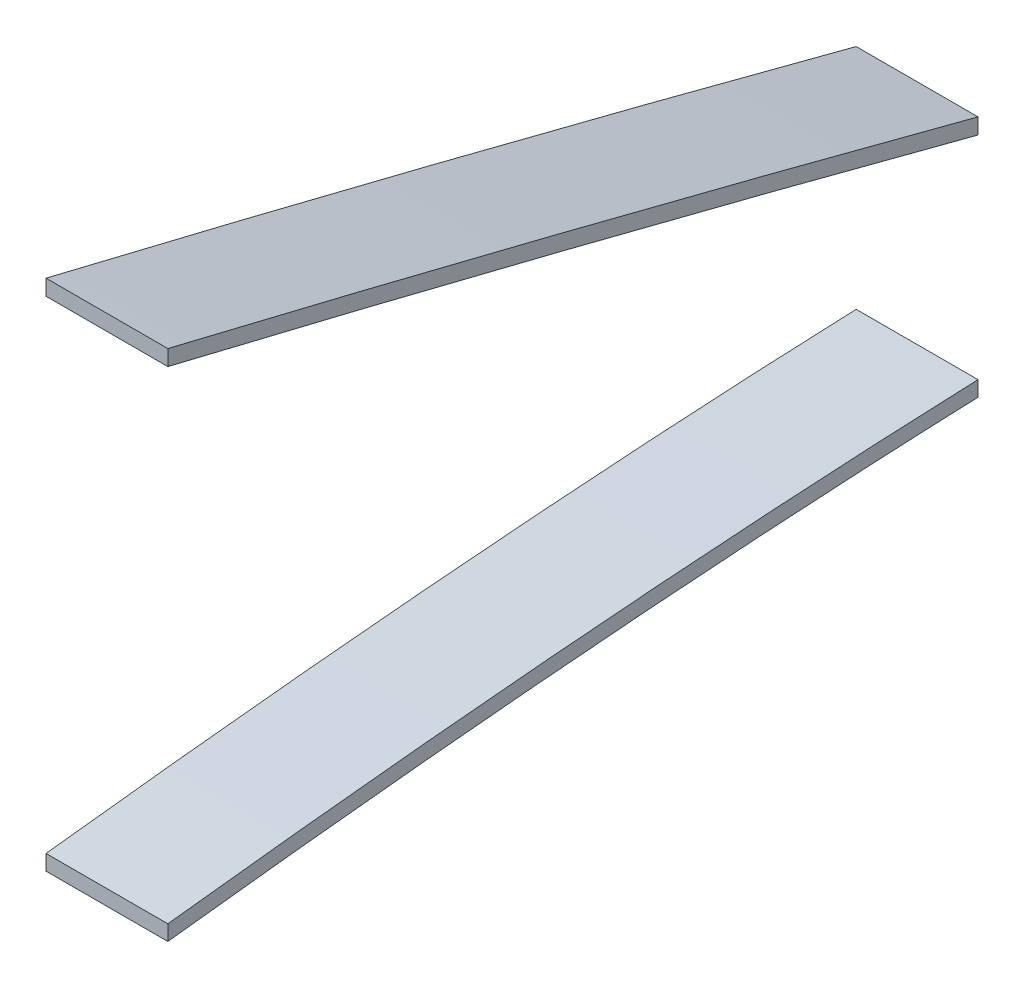
ISO-10303-21;
HEADER;
FILE_DESCRIPTION(('STEP AP214'),'2;1');
FILE_NAME('part.step','',(''),(''),'','','');
FILE_SCHEMA(('AUTOMOTIVE_DESIGN { 1 0 10303 214 1 1 1 1 }'));
ENDSEC;
DATA;
#1=APPLICATION_CONTEXT('core data for automotive mechanical design processes');
#2=APPLICATION_PROTOCOL_DEFINITION('international standard','automotive_design',2000,#1);
#3=PRODUCT_CONTEXT('',#1,'mechanical');
#4=PRODUCT('Part','Part','',(#3));
#5=PRODUCT_RELATED_PRODUCT_CATEGORY('part','',(#4));
#6=PRODUCT_DEFINITION_FORMATION('','',#4);
#7=PRODUCT_DEFINITION_CONTEXT('part definition',#1,'design');
#8=PRODUCT_DEFINITION('design','',#6,#7);
#9=PRODUCT_DEFINITION_SHAPE('','',#8);
#10=(LENGTH_UNIT() NAMED_UNIT(*) SI_UNIT(.MILLI.,.METRE.));
#11=(NAMED_UNIT(*) PLANE_ANGLE_UNIT() SI_UNIT($,.RADIAN.));
#12=(NAMED_UNIT(*) SI_UNIT($,.STERADIAN.) SOLID_ANGLE_UNIT());
#13=UNCERTAINTY_MEASURE_WITH_UNIT(LENGTH_MEASURE(1.E-05),#10,'distance_accuracy_value','');
#14=(GEOMETRIC_REPRESENTATION_CONTEXT(3) GLOBAL_UNCERTAINTY_ASSIGNED_CONTEXT((#13)) GLOBAL_UNIT_ASSIGNED_CONTEXT((#10,
#11,#12)) REPRESENTATION_CONTEXT('',''));
#15=CARTESIAN_POINT('',(0.,0.,0.));
#16=DIRECTION('',(0.,0.,1.));
#17=DIRECTION('',(1.,0.,0.));
#18=AXIS2_PLACEMENT_3D('',#15,#16,#17);
#19=CARTESIAN_POINT('',(6.35,-0.0168698697803817,-1.58896756731634));
#20=CARTESIAN_POINT('',(6.35,-0.278093575405853,-1.59778567538342));
#21=CARTESIAN_POINT('',(6.35,-0.817071560687652,-1.61698852295705));
#22=CARTESIAN_POINT('',(6.35,-1.5250777063707,-1.67055282833132));
#23=CARTESIAN_POINT('',(6.35,-2.23953985681244,-1.77272911801303));
#24=CARTESIAN_POINT('',(6.35,-3.2170399545111,-1.96449824112025));
#25=CARTESIAN_POINT('',(6.35,-4.47308667544305,-2.28220569209763));
#26=CARTESIAN_POINT('',(6.35,-6.45569044251883,-2.89195735088694));
#27=CARTESIAN_POINT('',(6.35,-8.91270651117956,-3.82502314776842));
#28=CARTESIAN_POINT('',(6.35,-12.764870838745,-5.5748206630622));
#29=CARTESIAN_POINT('',(6.35,-17.4946939025467,-8.15485573251682));
#30=CARTESIAN_POINT('',(6.35,-25.0362925123383,-12.5101141172109));
#31=CARTESIAN_POINT('',(6.35,-34.2942736430627,-18.1123469115671));
#32=CARTESIAN_POINT('',(6.35,-45.1810251619868,-25.230105591362));
#33=CARTESIAN_POINT('',(6.35,-53.8227317037622,-31.689080193494));
#34=CARTESIAN_POINT('',(6.35,-60.4726069561864,-37.2128263714012));
#35=CARTESIAN_POINT('',(6.35,-66.962933883926,-42.9501181028563));
#36=CARTESIAN_POINT('',(6.35,-74.4394415189749,-50.6018486257846));
#37=CARTESIAN_POINT('',(6.35,-81.5128401744618,-61.3489491705267));
#38=CARTESIAN_POINT('',(6.35,-86.5672767678429,-73.159446713042));
#39=CARTESIAN_POINT('',(6.35,-90.1112052326867,-85.6410448979768));
#40=CARTESIAN_POINT('',(6.35,-92.857558138955,-98.3222524640694));
#41=CARTESIAN_POINT('',(6.35,-95.4884593166877,-115.423728280371));
#42=CARTESIAN_POINT('',(6.35,-97.1574166185787,-137.057042994171));
#43=CARTESIAN_POINT('',(6.35,-97.3913575328663,-163.09710904146));
#44=CARTESIAN_POINT('',(6.35,-96.2564047503436,-189.13539327614));
#45=CARTESIAN_POINT('',(6.35,-94.0860606996018,-215.119495237718));
#46=CARTESIAN_POINT('',(6.35,-91.1098097619557,-241.033805840036));
#47=CARTESIAN_POINT('',(6.35,-86.3075505253941,-275.492090275555));
#48=CARTESIAN_POINT('',(6.35,-79.1224787107728,-318.404073319138));
#49=CARTESIAN_POINT('',(6.35,-69.4844112272533,-369.735601224399));
#50=CARTESIAN_POINT('',(6.35,-59.4768027176839,-421.013521647914));
#51=CARTESIAN_POINT('',(6.35,-49.6150737617801,-472.334965082267));
#52=CARTESIAN_POINT('',(6.35,-40.3589258634731,-523.784524343132));
#53=CARTESIAN_POINT('',(6.35,-32.1357040424635,-575.425677634064));
#54=CARTESIAN_POINT('',(6.35,-25.4119138999749,-627.302116658694));
#55=CARTESIAN_POINT('',(6.35,-21.5032379052925,-670.741751073083));
#56=CARTESIAN_POINT('',(6.35,-19.8162969755378,-705.603952790565));
#57=CARTESIAN_POINT('',(6.35,-19.41220767749,-731.78903132868));
#58=CARTESIAN_POINT('',(6.35,-20.1502189024007,-758.00034587372));
#59=CARTESIAN_POINT('',(6.35,-21.867269156407,-775.446944988084));
#60=CARTESIAN_POINT('',(6.35,-23.1184231765888,-784.106482277342));
#61=B_SPLINE_CURVE_WITH_KNOTS('',3,(#19,#20,#21,#22,#23,#24,#25,#26,#27,#28,#29,#30,#31,#32,#33,
#34,#35,#36,#37,#38,#39,#40,#41,#42,#43,#44,#45,#46,#47,#48,#49,#50,#51,#52,#53,#54,#55,#56,#57,
#58,#59,#60),.UNSPECIFIED.,.F.,.F.,(4,1,1,1,1,1,1,1,1,1,1,1,1,1,1,1,1,1,1,1,1,1,1,1,1,1,1,1,1,1,
1,1,1,1,1,1,1,1,1,4),(8.23654502113766E-05,0.00103762246756374,0.00199287948491611,
0.00294813650226847,0.00390339351962084,0.00581390755432556,0.00772442158903029,
0.0115454496584398,0.0153664777278492,0.0230085338666681,0.030650590005487,0.0459347022831249,
0.0612188145607627,0.0765029268384006,0.0841449829772195,0.0917870391160384,0.107071151393676,
0.122355263671314,0.137639375948952,0.15292348822659,0.168207600504228,0.183491712781865,
0.214059937337141,0.244628161892417,0.275196386447692,0.305764611002968,0.336332835558244,
0.366901060113519,0.428037509224071,0.489173958334622,0.550310407445173,0.611446856555725,
0.672583305666276,0.733719754776827,0.794856203887379,0.85599265299793,0.886560877553206,
0.917129102108482,0.947697326663757,0.978265551219033),.UNSPECIFIED.);
#62=DIRECTION('',(-1.,0.,0.));
#63=VECTOR('',#62,1.);
#64=SURFACE_OF_LINEAR_EXTRUSION('',#61,#63);
#65=CARTESIAN_POINT('',(-6.35,-0.0168698697803817,-1.58896756731634));
#66=CARTESIAN_POINT('',(-6.35,-0.278093575405853,-1.59778567538342));
#67=CARTESIAN_POINT('',(-6.35,-0.817071560687652,-1.61698852295705));
#68=CARTESIAN_POINT('',(-6.35,-1.5250777063707,-1.67055282833132));
#69=CARTESIAN_POINT('',(-6.35,-2.23953985681244,-1.77272911801303));
#70=CARTESIAN_POINT('',(-6.35,-3.2170399545111,-1.96449824112025));
#71=CARTESIAN_POINT('',(-6.35,-4.47308667544305,-2.28220569209763));
#72=CARTESIAN_POINT('',(-6.35,-6.45569044251883,-2.89195735088694));
#73=CARTESIAN_POINT('',(-6.35,-8.91270651117956,-3.82502314776842));
#74=CARTESIAN_POINT('',(-6.35,-12.764870838745,-5.5748206630622));
#75=CARTESIAN_POINT('',(-6.35,-17.4946939025467,-8.15485573251682));
#76=CARTESIAN_POINT('',(-6.35,-25.0362925123383,-12.5101141172109));
#77=CARTESIAN_POINT('',(-6.35,-34.2942736430627,-18.1123469115671));
#78=CARTESIAN_POINT('',(-6.35,-45.1810251619868,-25.230105591362));
#79=CARTESIAN_POINT('',(-6.35,-53.8227317037622,-31.689080193494));
#80=CARTESIAN_POINT('',(-6.35,-60.4726069561864,-37.2128263714012));
#81=CARTESIAN_POINT('',(-6.35,-66.962933883926,-42.9501181028563));
#82=CARTESIAN_POINT('',(-6.35,-74.4394415189749,-50.6018486257846));
#83=CARTESIAN_POINT('',(-6.35,-81.5128401744618,-61.3489491705267));
#84=CARTESIAN_POINT('',(-6.35,-86.5672767678429,-73.159446713042));
#85=CARTESIAN_POINT('',(-6.35,-90.1112052326867,-85.6410448979768));
#86=CARTESIAN_POINT('',(-6.35,-92.857558138955,-98.3222524640694));
#87=CARTESIAN_POINT('',(-6.35,-95.4884593166877,-115.423728280371));
#88=CARTESIAN_POINT('',(-6.35,-97.1574166185787,-137.057042994171));
#89=CARTESIAN_POINT('',(-6.35,-97.3913575328663,-163.09710904146));
#90=CARTESIAN_POINT('',(-6.35,-96.2564047503436,-189.13539327614));
#91=CARTESIAN_POINT('',(-6.35,-94.0860606996018,-215.119495237718));
#92=CARTESIAN_POINT('',(-6.35,-91.1098097619557,-241.033805840036));
#93=CARTESIAN_POINT('',(-6.35,-86.3075505253941,-275.492090275555));
#94=CARTESIAN_POINT('',(-6.35,-79.1224787107728,-318.404073319138));
#95=CARTESIAN_POINT('',(-6.35,-69.4844112272533,-369.735601224399));
#96=CARTESIAN_POINT('',(-6.35,-59.4768027176839,-421.013521647914));
#97=CARTESIAN_POINT('',(-6.35,-49.6150737617801,-472.334965082267));
#98=CARTESIAN_POINT('',(-6.35,-40.3589258634731,-523.784524343132));
#99=CARTESIAN_POINT('',(-6.35,-32.1357040424635,-575.425677634064));
#100=CARTESIAN_POINT('',(-6.35,-25.4119138999749,-627.302116658694));
#101=CARTESIAN_POINT('',(-6.35,-21.5032379052925,-670.741751073083));
#102=CARTESIAN_POINT('',(-6.35,-19.8162969755378,-705.603952790565));
#103=CARTESIAN_POINT('',(-6.35,-19.41220767749,-731.78903132868));
#104=CARTESIAN_POINT('',(-6.35,-20.1502189024007,-758.00034587372));
#105=CARTESIAN_POINT('',(-6.35,-21.867269156407,-775.446944988084));
#106=CARTESIAN_POINT('',(-6.35,-23.1184231765888,-784.106482277342));
#107=B_SPLINE_CURVE_WITH_KNOTS('',3,(#65,#66,#67,#68,#69,#70,#71,#72,#73,#74,#75,#76,#77,#78,
#79,#80,#81,#82,#83,#84,#85,#86,#87,#88,#89,#90,#91,#92,#93,#94,#95,#96,#97,#98,#99,#100,#101,
#102,#103,#104,#105,#106),.UNSPECIFIED.,.F.,.F.,(4,1,1,1,1,1,1,1,1,1,1,1,1,1,1,1,1,1,1,1,1,1,1,
1,1,1,1,1,1,1,1,1,1,1,1,1,1,1,1,4),(8.23654502113766E-05,0.00103762246756374,
0.00199287948491611,0.00294813650226847,0.00390339351962084,0.00581390755432556,
0.00772442158903029,0.0115454496584398,0.0153664777278492,0.0230085338666681,0.030650590005487,
0.0459347022831249,0.0612188145607627,0.0765029268384006,0.0841449829772195,0.0917870391160384,
0.107071151393676,0.122355263671314,0.137639375948952,0.15292348822659,0.168207600504228,
0.183491712781865,0.214059937337141,0.244628161892417,0.275196386447692,0.305764611002968,
0.336332835558244,0.366901060113519,0.428037509224071,0.489173958334622,0.550310407445173,
0.611446856555725,0.672583305666276,0.733719754776827,0.794856203887379,0.85599265299793,
0.886560877553206,0.917129102108482,0.947697326663757,0.978265551219033),.UNSPECIFIED.);
#108=CARTESIAN_POINT('',(-6.35,-27.0325991179698,-616.096053398591));
#109=VERTEX_POINT('',#108);
#110=CARTESIAN_POINT('',(-6.35,-20.1371548542674,-700.551053398607));
#111=VERTEX_POINT('',#110);
#112=EDGE_CURVE('E125',#109,#111,#107,.T.);
#113=ORIENTED_EDGE('',*,*,#112,.F.);
#114=DIRECTION('',(-1.,0.,0.));
#115=VECTOR('',#114,1.);
#116=CARTESIAN_POINT('',(6.35,-27.0325991179698,-616.096053398591));
#117=LINE('',#116,#115);
#118=CARTESIAN_POINT('',(6.35,-27.0325991179698,-616.096053398591));
#119=VERTEX_POINT('',#118);
#120=EDGE_CURVE('E12',#119,#109,#117,.T.);
#121=ORIENTED_EDGE('',*,*,#120,.F.);
#122=CARTESIAN_POINT('',(6.35,-20.1371548542674,-700.551053398607));
#123=VERTEX_POINT('',#122);
#124=EDGE_CURVE('E94',#119,#123,#61,.T.);
#125=ORIENTED_EDGE('',*,*,#124,.T.);
#126=DIRECTION('',(-1.,0.,0.));
#127=VECTOR('',#126,1.);
#128=CARTESIAN_POINT('',(6.35,-20.1371548542674,-700.551053398607));
#129=LINE('',#128,#127);
#130=EDGE_CURVE('E62',#123,#111,#129,.T.);
#131=ORIENTED_EDGE('',*,*,#130,.T.);
#132=EDGE_LOOP('',(#113,#121,#125,#131));
#133=FACE_BOUND('',#132,.T.);
#134=ADVANCED_FACE('F45',(#133),#64,.T.);
#135=CARTESIAN_POINT('',(6.35,-4.60005606692878E-11,-616.096053398593));
#136=DIRECTION('',(0.,0.,-1.));
#137=DIRECTION('',(0.,1.,0.));
#138=AXIS2_PLACEMENT_3D('',#135,#136,#137);
#139=PLANE('',#138);
#140=DIRECTION('',(0.,-1.,0.));
#141=VECTOR('',#140,1.);
#142=CARTESIAN_POINT('',(-6.35,-4.60005606692878E-11,-616.096053398593));
#143=LINE('',#142,#141);
#144=CARTESIAN_POINT('',(-6.35,-28.6308055427422,-616.096053398591));
#145=VERTEX_POINT('',#144);
#146=EDGE_CURVE('E100',#109,#145,#143,.T.);
#147=ORIENTED_EDGE('',*,*,#146,.T.);
#148=DIRECTION('',(-1.,0.,0.));
#149=VECTOR('',#148,1.);
#150=CARTESIAN_POINT('',(6.35,-28.6308055427422,-616.096053398591));
#151=LINE('',#150,#149);
#152=CARTESIAN_POINT('',(6.35,-28.6308055427422,-616.096053398591));
#153=VERTEX_POINT('',#152);
#154=EDGE_CURVE('E54',#153,#145,#151,.T.);
#155=ORIENTED_EDGE('',*,*,#154,.F.);
#156=DIRECTION('',(0.,-1.,0.));
#157=VECTOR('',#156,1.);
#158=CARTESIAN_POINT('',(6.35,-4.60005606692878E-11,-616.096053398593));
#159=LINE('',#158,#157);
#160=EDGE_CURVE('E88',#119,#153,#159,.T.);
#161=ORIENTED_EDGE('',*,*,#160,.F.);
#162=ORIENTED_EDGE('',*,*,#120,.T.);
#163=EDGE_LOOP('',(#147,#155,#161,#162));
#164=FACE_BOUND('',#163,.T.);
#165=ADVANCED_FACE('F98',(#164),#139,.F.);
#166=CARTESIAN_POINT('',(6.35,0.,0.));
#167=CARTESIAN_POINT('',(6.35,-0.519005663292632,-0.0174520328861116));
#168=CARTESIAN_POINT('',(6.35,-1.83376590693266,-0.061662030289511));
#169=CARTESIAN_POINT('',(6.35,-4.39681155697538,-0.570189514846942));
#170=CARTESIAN_POINT('',(6.35,-10.616386461847,-2.53612961983818));
#171=CARTESIAN_POINT('',(6.35,-20.5501355548529,-7.99821180017807));
#172=CARTESIAN_POINT('',(6.35,-34.1849518234535,-16.113653600375));
#173=CARTESIAN_POINT('',(6.35,-48.9001609581786,-25.7512677237822));
#174=CARTESIAN_POINT('',(6.35,-62.9387722638163,-36.9320129206869));
#175=CARTESIAN_POINT('',(6.35,-75.9185649305712,-49.3363693896182));
#176=CARTESIAN_POINT('',(6.35,-85.624987008219,-65.2269065390065));
#177=CARTESIAN_POINT('',(6.35,-91.71735718507,-84.4527650462028));
#178=CARTESIAN_POINT('',(6.35,-96.1515107337894,-106.852134497523));
#179=CARTESIAN_POINT('',(6.35,-98.5722491750476,-132.510932075963));
#180=CARTESIAN_POINT('',(6.35,-99.0923828679645,-161.194365788224));
#181=CARTESIAN_POINT('',(6.35,-97.7042437107787,-192.761343292225));
#182=CARTESIAN_POINT('',(6.35,-94.5118392960459,-227.038217577419));
#183=CARTESIAN_POINT('',(6.35,-89.663828122523,-263.83475650239));
#184=CARTESIAN_POINT('',(6.35,-83.3884450275924,-302.921473177171));
#185=CARTESIAN_POINT('',(6.35,-75.9777868038423,-344.017776041379));
#186=CARTESIAN_POINT('',(6.35,-67.7807073824771,-386.776799789042));
#187=CARTESIAN_POINT('',(6.35,-59.2023239554423,-430.774614869895));
#188=CARTESIAN_POINT('',(6.35,-50.6638051202139,-475.496263681326));
#189=CARTESIAN_POINT('',(6.35,-42.603612471025,-520.335279967164));
#190=CARTESIAN_POINT('',(6.35,-35.4227963472458,-564.588870456427));
#191=CARTESIAN_POINT('',(6.35,-29.4733080838417,-607.47093439983));
#192=CARTESIAN_POINT('',(6.35,-25.014473383068,-648.127538759033));
#193=CARTESIAN_POINT('',(6.35,-22.1862417823146,-685.667615873141));
#194=CARTESIAN_POINT('',(6.35,-21.0047614095552,-719.196759596274));
#195=CARTESIAN_POINT('',(6.35,-21.2786363123237,-747.830287498204));
#196=CARTESIAN_POINT('',(6.35,-22.8547119223691,-770.688405742871));
#197=CARTESIAN_POINT('',(6.35,-25.0735156397946,-787.091395164099));
#198=CARTESIAN_POINT('',(6.35,-26.8193281874914,-796.842303094868));
#199=CARTESIAN_POINT('',(6.35,-27.775140745329,-801.097715575015));
#200=CARTESIAN_POINT('',(6.35,-28.0117320332953,-802.151053398607));
#201=B_SPLINE_CURVE_WITH_KNOTS('',3,(#166,#167,#168,#169,#170,#171,#172,#173,#174,#175,#176,
#177,#178,#179,#180,#181,#182,#183,#184,#185,#186,#187,#188,#189,#190,#191,#192,#193,#194,#195,
#196,#197,#198,#199,#200),.UNSPECIFIED.,.F.,.F.,(4,1,1,1,1,1,1,1,1,1,1,1,1,1,1,1,1,1,1,1,1,1,1,
1,1,1,1,1,1,1,1,1,4),(0.,0.00182090933464196,0.00461278049497482,0.00913453013845994,
0.0246759391487866,0.0441527676320363,0.064937102928184,0.0863209881898911,0.107137618403306,
0.127599776801144,0.150892792929449,0.177565203441126,0.207667777211646,0.241222088418686,
0.278203414074027,0.318526302563412,0.362030578586225,0.408464624639153,0.457479061609077,
0.508614437318857,0.56129601455956,0.61483529472868,0.668437533813961,0.721214466101836,
0.772202341152847,0.82039348306447,0.86476592329606,0.904323703961063,0.938131580580512,
0.965241743376092,0.984690446789536,0.996210442222917,1.),.UNSPECIFIED.);
#202=DIRECTION('',(-1.,0.,0.));
#203=VECTOR('',#202,1.);
#204=SURFACE_OF_LINEAR_EXTRUSION('',#201,#203);
#205=CARTESIAN_POINT('',(-6.35,0.,0.));
#206=CARTESIAN_POINT('',(-6.35,-0.519005663292632,-0.0174520328861116));
#207=CARTESIAN_POINT('',(-6.35,-1.83376590693266,-0.061662030289511));
#208=CARTESIAN_POINT('',(-6.35,-4.39681155697538,-0.570189514846942));
#209=CARTESIAN_POINT('',(-6.35,-10.616386461847,-2.53612961983818));
#210=CARTESIAN_POINT('',(-6.35,-20.5501355548529,-7.99821180017807));
#211=CARTESIAN_POINT('',(-6.35,-34.1849518234535,-16.113653600375));
#212=CARTESIAN_POINT('',(-6.35,-48.9001609581786,-25.7512677237822));
#213=CARTESIAN_POINT('',(-6.35,-62.9387722638163,-36.9320129206869));
#214=CARTESIAN_POINT('',(-6.35,-75.9185649305712,-49.3363693896182));
#215=CARTESIAN_POINT('',(-6.35,-85.624987008219,-65.2269065390065));
#216=CARTESIAN_POINT('',(-6.35,-91.71735718507,-84.4527650462028));
#217=CARTESIAN_POINT('',(-6.35,-96.1515107337894,-106.852134497523));
#218=CARTESIAN_POINT('',(-6.35,-98.5722491750476,-132.510932075963));
#219=CARTESIAN_POINT('',(-6.35,-99.0923828679645,-161.194365788224));
#220=CARTESIAN_POINT('',(-6.35,-97.7042437107787,-192.761343292225));
#221=CARTESIAN_POINT('',(-6.35,-94.5118392960459,-227.038217577419));
#222=CARTESIAN_POINT('',(-6.35,-89.663828122523,-263.83475650239));
#223=CARTESIAN_POINT('',(-6.35,-83.3884450275924,-302.921473177171));
#224=CARTESIAN_POINT('',(-6.35,-75.9777868038423,-344.017776041379));
#225=CARTESIAN_POINT('',(-6.35,-67.7807073824771,-386.776799789042));
#226=CARTESIAN_POINT('',(-6.35,-59.2023239554423,-430.774614869895));
#227=CARTESIAN_POINT('',(-6.35,-50.6638051202139,-475.496263681326));
#228=CARTESIAN_POINT('',(-6.35,-42.603612471025,-520.335279967164));
#229=CARTESIAN_POINT('',(-6.35,-35.4227963472458,-564.588870456427));
#230=CARTESIAN_POINT('',(-6.35,-29.4733080838417,-607.47093439983));
#231=CARTESIAN_POINT('',(-6.35,-25.014473383068,-648.127538759033));
#232=CARTESIAN_POINT('',(-6.35,-22.1862417823146,-685.667615873141));
#233=CARTESIAN_POINT('',(-6.35,-21.0047614095552,-719.196759596274));
#234=CARTESIAN_POINT('',(-6.35,-21.2786363123237,-747.830287498204));
#235=CARTESIAN_POINT('',(-6.35,-22.8547119223691,-770.688405742871));
#236=CARTESIAN_POINT('',(-6.35,-25.0735156397946,-787.091395164099));
#237=CARTESIAN_POINT('',(-6.35,-26.8193281874914,-796.842303094868));
#238=CARTESIAN_POINT('',(-6.35,-27.775140745329,-801.097715575015));
#239=CARTESIAN_POINT('',(-6.35,-28.0117320332953,-802.151053398607));
#240=B_SPLINE_CURVE_WITH_KNOTS('',3,(#205,#206,#207,#208,#209,#210,#211,#212,#213,#214,#215,
#216,#217,#218,#219,#220,#221,#222,#223,#224,#225,#226,#227,#228,#229,#230,#231,#232,#233,#234,
#235,#236,#237,#238,#239),.UNSPECIFIED.,.F.,.F.,(4,1,1,1,1,1,1,1,1,1,1,1,1,1,1,1,1,1,1,1,1,1,1,
1,1,1,1,1,1,1,1,1,4),(0.,0.00182090933464196,0.00461278049497482,0.00913453013845994,
0.0246759391487866,0.0441527676320363,0.064937102928184,0.0863209881898911,0.107137618403306,
0.127599776801144,0.150892792929449,0.177565203441126,0.207667777211646,0.241222088418686,
0.278203414074027,0.318526302563412,0.362030578586225,0.408464624639153,0.457479061609077,
0.508614437318857,0.56129601455956,0.61483529472868,0.668437533813961,0.721214466101836,
0.772202341152847,0.82039348306447,0.86476592329606,0.904323703961063,0.938131580580512,
0.965241743376092,0.984690446789536,0.996210442222917,1.),.UNSPECIFIED.);
#241=CARTESIAN_POINT('',(-6.35,-21.7251284021518,-700.551053398607));
#242=VERTEX_POINT('',#241);
#243=EDGE_CURVE('E128',#145,#242,#240,.T.);
#244=ORIENTED_EDGE('',*,*,#243,.T.);
#245=DIRECTION('',(-1.,0.,0.));
#246=VECTOR('',#245,1.);
#247=CARTESIAN_POINT('',(6.35,-21.7251284021518,-700.551053398607));
#248=LINE('',#247,#246);
#249=CARTESIAN_POINT('',(6.35,-21.7251284021518,-700.551053398607));
#250=VERTEX_POINT('',#249);
#251=EDGE_CURVE('E76',#250,#242,#248,.T.);
#252=ORIENTED_EDGE('',*,*,#251,.F.);
#253=EDGE_CURVE('E93',#153,#250,#201,.T.);
#254=ORIENTED_EDGE('',*,*,#253,.F.);
#255=ORIENTED_EDGE('',*,*,#154,.T.);
#256=EDGE_LOOP('',(#244,#252,#254,#255));
#257=FACE_BOUND('',#256,.T.);
#258=ADVANCED_FACE('F103',(#257),#204,.F.);
#259=CARTESIAN_POINT('',(6.35,3.07280287365297E-12,-700.551053398607));
#260=DIRECTION('',(0.,0.,-1.));
#261=DIRECTION('',(0.,1.,0.));
#262=AXIS2_PLACEMENT_3D('',#259,#260,#261);
#263=PLANE('',#262);
#264=DIRECTION('',(0.,-1.,0.));
#265=VECTOR('',#264,1.);
#266=CARTESIAN_POINT('',(-6.35,3.07280287365297E-12,-700.551053398607));
#267=LINE('',#266,#265);
#268=EDGE_CURVE('E139',#111,#242,#267,.T.);
#269=ORIENTED_EDGE('',*,*,#268,.F.);
#270=ORIENTED_EDGE('',*,*,#130,.F.);
#271=DIRECTION('',(0.,-1.,0.));
#272=VECTOR('',#271,1.);
#273=CARTESIAN_POINT('',(6.35,3.07280287365297E-12,-700.551053398607));
#274=LINE('',#273,#272);
#275=EDGE_CURVE('E104',#123,#250,#274,.T.);
#276=ORIENTED_EDGE('',*,*,#275,.T.);
#277=ORIENTED_EDGE('',*,*,#251,.T.);
#278=EDGE_LOOP('',(#269,#270,#276,#277));
#279=FACE_BOUND('',#278,.T.);
#280=ADVANCED_FACE('F117',(#279),#263,.T.);
#281=CARTESIAN_POINT('',(6.35,0.,0.));
#282=DIRECTION('',(1.,0.,0.));
#283=DIRECTION('',(0.,0.,-1.));
#284=AXIS2_PLACEMENT_3D('',#281,#282,#283);
#285=PLANE('',#284);
#286=ORIENTED_EDGE('',*,*,#124,.F.);
#287=ORIENTED_EDGE('',*,*,#160,.T.);
#288=ORIENTED_EDGE('',*,*,#253,.T.);
#289=ORIENTED_EDGE('',*,*,#275,.F.);
#290=EDGE_LOOP('',(#286,#287,#288,#289));
#291=FACE_BOUND('',#290,.T.);
#292=ADVANCED_FACE('F90',(#291),#285,.T.);
#293=CARTESIAN_POINT('',(-6.35,0.,0.));
#294=DIRECTION('',(1.,0.,0.));
#295=DIRECTION('',(0.,0.,-1.));
#296=AXIS2_PLACEMENT_3D('',#293,#294,#295);
#297=PLANE('',#296);
#298=ORIENTED_EDGE('',*,*,#112,.T.);
#299=ORIENTED_EDGE('',*,*,#268,.T.);
#300=ORIENTED_EDGE('',*,*,#243,.F.);
#301=ORIENTED_EDGE('',*,*,#146,.F.);
#302=EDGE_LOOP('',(#298,#299,#300,#301));
#303=FACE_BOUND('',#302,.T.);
#304=ADVANCED_FACE('F155',(#303),#297,.F.);
#305=CLOSED_SHELL('',(#134,#165,#258,#280,#292,#304));
#306=MANIFOLD_SOLID_BREP('B2',#305);
#307=CARTESIAN_POINT('',(6.35,-23.1184231765888,-784.106482277342));
#308=CARTESIAN_POINT('',(6.35,-21.5941948646314,-780.160330066746));
#309=CARTESIAN_POINT('',(6.35,-18.6420313640257,-772.229019430764));
#310=CARTESIAN_POINT('',(6.35,-14.6721592573552,-760.174514143023));
#311=CARTESIAN_POINT('',(6.35,-11.061270892252,-747.991113763068));
#312=CARTESIAN_POINT('',(6.35,-6.45595444735922,-731.645658465396));
#313=CARTESIAN_POINT('',(6.35,-0.845295728828582,-711.176791695));
#314=CARTESIAN_POINT('',(6.35,7.8115210058812,-678.329743560459));
#315=CARTESIAN_POINT('',(6.35,18.257538211217,-637.171287831332));
#316=CARTESIAN_POINT('',(6.35,30.1162057762093,-587.618318744646));
#317=CARTESIAN_POINT('',(6.35,41.1374524116112,-537.877742251688));
#318=CARTESIAN_POINT('',(6.35,51.0911698472495,-487.918910070674));
#319=CARTESIAN_POINT('',(6.35,59.7239737986415,-437.720761599895));
#320=CARTESIAN_POINT('',(6.35,66.7289053590127,-387.278741139135));
#321=CARTESIAN_POINT('',(6.35,70.9360377288318,-345.050560772716));
#322=CARTESIAN_POINT('',(6.35,73.0641477653892,-311.18788932569));
#323=CARTESIAN_POINT('',(6.35,74.2092196354668,-277.279562300467));
#324=CARTESIAN_POINT('',(6.35,73.8800008847884,-243.342738652409));
#325=CARTESIAN_POINT('',(6.35,71.9586220108794,-209.476353678726));
#326=CARTESIAN_POINT('',(6.35,69.6475228760495,-184.143820783248));
#327=CARTESIAN_POINT('',(6.35,66.4677558472745,-158.904994034112));
#328=CARTESIAN_POINT('',(6.35,62.3586391617327,-133.8071867013));
#329=CARTESIAN_POINT('',(6.35,57.1874016990518,-108.915504076387));
#330=CARTESIAN_POINT('',(6.35,51.8354380146184,-88.4250104282845));
#331=CARTESIAN_POINT('',(6.35,46.781142415969,-72.2737715807522));
#332=CARTESIAN_POINT('',(6.35,42.5401308058817,-60.3184424568568));
#333=CARTESIAN_POINT('',(6.35,37.7737253953122,-48.577097756103));
#334=CARTESIAN_POINT('',(6.35,32.3878283625538,-37.1196846287895));
#335=CARTESIAN_POINT('',(6.35,27.2537575462737,-27.9271564923142));
#336=CARTESIAN_POINT('',(6.35,22.6553737471211,-20.9063850305832));
#337=CARTESIAN_POINT('',(6.35,18.9075077927961,-15.8717047100105));
#338=CARTESIAN_POINT('',(6.35,14.8240531255331,-11.1186200473068));
#339=CARTESIAN_POINT('',(6.35,11.0807152552971,-7.55821558571599));
#340=CARTESIAN_POINT('',(6.35,7.83489505129662,-5.02510578688502));
#341=CARTESIAN_POINT('',(6.35,5.29547537768222,-3.38923844421585));
#342=CARTESIAN_POINT('',(6.35,3.06142620290842,-2.31109107008206));
#343=CARTESIAN_POINT('',(6.35,1.48593186176602,-1.80559091181272));
#344=CARTESIAN_POINT('',(6.35,0.72579482126348,-1.65397388534357));
#345=CARTESIAN_POINT('',(6.35,0.34989447911426,-1.61043534130219));
#346=CARTESIAN_POINT('',(6.35,0.100324503404875,-1.59546044383819));
#347=CARTESIAN_POINT('',(6.35,-0.0168698697803871,-1.58896756731634));
#348=B_SPLINE_CURVE_WITH_KNOTS('',3,(#307,#308,#309,#310,#311,#312,#313,#314,#315,#316,#317,
#318,#319,#320,#321,#322,#323,#324,#325,#326,#327,#328,#329,#330,#331,#332,#333,#334,#335,#336,
#337,#338,#339,#340,#341,#342,#343,#344,#345,#346,#347),.UNSPECIFIED.,.F.,.F.,(4,1,1,1,1,1,1,1,
1,1,1,1,1,1,1,1,1,1,1,1,1,1,1,1,1,1,1,1,1,1,1,1,1,1,1,1,1,1,4),(0.0222996498274626,
0.0375748876942013,0.05285012556094,0.0681253634276787,0.0834006012944174,0.113951077027895,
0.144501552761372,0.205602504228327,0.266703455695282,0.327804407162237,0.388905358629191,
0.450006310096146,0.511107261563101,0.572208213030056,0.602758688763533,0.633309164497011,
0.694410115963965,0.724960591697443,0.75551106743092,0.786061543164398,0.816612018897875,
0.847162494631353,0.87771297036483,0.892988208231569,0.908263446098307,0.923538683965046,
0.938813921831785,0.954089159698523,0.961726778631893,0.969364397565262,0.977002016498631,
0.984639635432001,0.988458444898685,0.99227725436537,0.996096063832055,0.998005468565397,
0.998960170932068,0.999437522115404,0.999914873298739),.UNSPECIFIED.);
#349=DIRECTION('',(-1.,0.,0.));
#350=VECTOR('',#349,1.);
#351=SURFACE_OF_LINEAR_EXTRUSION('',#348,#350);
#352=CARTESIAN_POINT('',(-6.35,-23.1184231765888,-784.106482277342));
#353=CARTESIAN_POINT('',(-6.35,-21.5941948646314,-780.160330066746));
#354=CARTESIAN_POINT('',(-6.35,-18.6420313640257,-772.229019430764));
#355=CARTESIAN_POINT('',(-6.35,-14.6721592573552,-760.174514143023));
#356=CARTESIAN_POINT('',(-6.35,-11.061270892252,-747.991113763068));
#357=CARTESIAN_POINT('',(-6.35,-6.45595444735922,-731.645658465396));
#358=CARTESIAN_POINT('',(-6.35,-0.845295728828582,-711.176791695));
#359=CARTESIAN_POINT('',(-6.35,7.8115210058812,-678.329743560459));
#360=CARTESIAN_POINT('',(-6.35,18.257538211217,-637.171287831332));
#361=CARTESIAN_POINT('',(-6.35,30.1162057762093,-587.618318744646));
#362=CARTESIAN_POINT('',(-6.35,41.1374524116112,-537.877742251688));
#363=CARTESIAN_POINT('',(-6.35,51.0911698472495,-487.918910070674));
#364=CARTESIAN_POINT('',(-6.35,59.7239737986415,-437.720761599895));
#365=CARTESIAN_POINT('',(-6.35,66.7289053590127,-387.278741139135));
#366=CARTESIAN_POINT('',(-6.35,70.9360377288318,-345.050560772716));
#367=CARTESIAN_POINT('',(-6.35,73.0641477653892,-311.18788932569));
#368=CARTESIAN_POINT('',(-6.35,74.2092196354668,-277.279562300467));
#369=CARTESIAN_POINT('',(-6.35,73.8800008847884,-243.342738652409));
#370=CARTESIAN_POINT('',(-6.35,71.9586220108794,-209.476353678726));
#371=CARTESIAN_POINT('',(-6.35,69.6475228760495,-184.143820783248));
#372=CARTESIAN_POINT('',(-6.35,66.4677558472745,-158.904994034112));
#373=CARTESIAN_POINT('',(-6.35,62.3586391617327,-133.8071867013));
#374=CARTESIAN_POINT('',(-6.35,57.1874016990518,-108.915504076387));
#375=CARTESIAN_POINT('',(-6.35,51.8354380146184,-88.4250104282845));
#376=CARTESIAN_POINT('',(-6.35,46.781142415969,-72.2737715807522));
#377=CARTESIAN_POINT('',(-6.35,42.5401308058817,-60.3184424568568));
#378=CARTESIAN_POINT('',(-6.35,37.7737253953122,-48.577097756103));
#379=CARTESIAN_POINT('',(-6.35,32.3878283625538,-37.1196846287895));
#380=CARTESIAN_POINT('',(-6.35,27.2537575462737,-27.9271564923142));
#381=CARTESIAN_POINT('',(-6.35,22.6553737471211,-20.9063850305832));
#382=CARTESIAN_POINT('',(-6.35,18.9075077927961,-15.8717047100105));
#383=CARTESIAN_POINT('',(-6.35,14.8240531255331,-11.1186200473068));
#384=CARTESIAN_POINT('',(-6.35,11.0807152552971,-7.55821558571599));
#385=CARTESIAN_POINT('',(-6.35,7.83489505129662,-5.02510578688502));
#386=CARTESIAN_POINT('',(-6.35,5.29547537768222,-3.38923844421585));
#387=CARTESIAN_POINT('',(-6.35,3.06142620290842,-2.31109107008206));
#388=CARTESIAN_POINT('',(-6.35,1.48593186176602,-1.80559091181272));
#389=CARTESIAN_POINT('',(-6.35,0.72579482126348,-1.65397388534357));
#390=CARTESIAN_POINT('',(-6.35,0.34989447911426,-1.61043534130219));
#391=CARTESIAN_POINT('',(-6.35,0.100324503404875,-1.59546044383819));
#392=CARTESIAN_POINT('',(-6.35,-0.0168698697803871,-1.58896756731634));
#393=B_SPLINE_CURVE_WITH_KNOTS('',3,(#352,#353,#354,#355,#356,#357,#358,#359,#360,#361,#362,
#363,#364,#365,#366,#367,#368,#369,#370,#371,#372,#373,#374,#375,#376,#377,#378,#379,#380,#381,
#382,#383,#384,#385,#386,#387,#388,#389,#390,#391,#392),.UNSPECIFIED.,.F.,.F.,(4,1,1,1,1,1,1,1,
1,1,1,1,1,1,1,1,1,1,1,1,1,1,1,1,1,1,1,1,1,1,1,1,1,1,1,1,1,1,4),(0.0222996498274626,
0.0375748876942013,0.05285012556094,0.0681253634276787,0.0834006012944174,0.113951077027895,
0.144501552761372,0.205602504228327,0.266703455695282,0.327804407162237,0.388905358629191,
0.450006310096146,0.511107261563101,0.572208213030056,0.602758688763533,0.633309164497011,
0.694410115963965,0.724960591697443,0.75551106743092,0.786061543164398,0.816612018897875,
0.847162494631353,0.87771297036483,0.892988208231569,0.908263446098307,0.923538683965046,
0.938813921831785,0.954089159698523,0.961726778631893,0.969364397565262,0.977002016498631,
0.984639635432001,0.988458444898685,0.99227725436537,0.996096063832055,0.998005468565397,
0.998960170932068,0.999437522115404,0.999914873298739),.UNSPECIFIED.);
#394=CARTESIAN_POINT('',(-6.35,1.94501203005551,-700.551053398607));
#395=VERTEX_POINT('',#394);
#396=CARTESIAN_POINT('',(-6.35,23.267161102306,-616.096053398595));
#397=VERTEX_POINT('',#396);
#398=EDGE_CURVE('E275',#395,#397,#393,.T.);
#399=ORIENTED_EDGE('',*,*,#398,.F.);
#400=DIRECTION('',(-1.,0.,0.));
#401=VECTOR('',#400,1.);
#402=CARTESIAN_POINT('',(6.35,1.94501203005551,-700.551053398607));
#403=LINE('',#402,#401);
#404=CARTESIAN_POINT('',(6.35,1.94501203005551,-700.551053398607));
#405=VERTEX_POINT('',#404);
#406=EDGE_CURVE('E43',#405,#395,#403,.T.);
#407=ORIENTED_EDGE('',*,*,#406,.F.);
#408=CARTESIAN_POINT('',(6.35,23.267161102306,-616.096053398595));
#409=VERTEX_POINT('',#408);
#410=EDGE_CURVE('E249',#405,#409,#348,.T.);
#411=ORIENTED_EDGE('',*,*,#410,.T.);
#412=DIRECTION('',(-1.,0.,0.));
#413=VECTOR('',#412,1.);
#414=CARTESIAN_POINT('',(6.35,23.267161102306,-616.096053398595));
#415=LINE('',#414,#413);
#416=EDGE_CURVE('E230',#409,#397,#415,.T.);
#417=ORIENTED_EDGE('',*,*,#416,.T.);
#418=EDGE_LOOP('',(#399,#407,#411,#417));
#419=FACE_BOUND('',#418,.T.);
#420=ADVANCED_FACE('F191',(#419),#351,.T.);
#421=CARTESIAN_POINT('',(6.35,3.07280287365297E-12,-700.551053398607));
#422=DIRECTION('',(0.,0.,-1.));
#423=DIRECTION('',(0.,1.,0.));
#424=AXIS2_PLACEMENT_3D('',#421,#422,#423);
#425=PLANE('',#424);
#426=DIRECTION('',(0.,-1.,0.));
#427=VECTOR('',#426,1.);
#428=CARTESIAN_POINT('',(-6.35,3.07280287365297E-12,-700.551053398607));
#429=LINE('',#428,#427);
#430=CARTESIAN_POINT('',(-6.35,3.58622222425279,-700.551053398607));
#431=VERTEX_POINT('',#430);
#432=EDGE_CURVE('E243',#431,#395,#429,.T.);
#433=ORIENTED_EDGE('',*,*,#432,.F.);
#434=DIRECTION('',(-1.,0.,0.));
#435=VECTOR('',#434,1.);
#436=CARTESIAN_POINT('',(6.35,3.58622222425279,-700.551053398607));
#437=LINE('',#436,#435);
#438=CARTESIAN_POINT('',(6.35,3.58622222425279,-700.551053398607));
#439=VERTEX_POINT('',#438);
#440=EDGE_CURVE('E200',#439,#431,#437,.T.);
#441=ORIENTED_EDGE('',*,*,#440,.F.);
#442=DIRECTION('',(0.,-1.,0.));
#443=VECTOR('',#442,1.);
#444=CARTESIAN_POINT('',(6.35,3.07280287365297E-12,-700.551053398607));
#445=LINE('',#444,#443);
#446=EDGE_CURVE('E241',#439,#405,#445,.T.);
#447=ORIENTED_EDGE('',*,*,#446,.T.);
#448=ORIENTED_EDGE('',*,*,#406,.T.);
#449=EDGE_LOOP('',(#433,#441,#447,#448));
#450=FACE_BOUND('',#449,.T.);
#451=ADVANCED_FACE('F239',(#450),#425,.T.);
#452=CARTESIAN_POINT('',(6.35,-28.0117320332953,-802.151053398607));
#453=CARTESIAN_POINT('',(6.35,-27.710542123527,-801.137231832094));
#454=CARTESIAN_POINT('',(6.35,-26.5641562510043,-797.27843482904));
#455=CARTESIAN_POINT('',(6.35,-23.4586005929967,-789.357225955684));
#456=CARTESIAN_POINT('',(6.35,-18.6435790763375,-777.061460680268));
#457=CARTESIAN_POINT('',(6.35,-13.0400649658381,-760.581722213746));
#458=CARTESIAN_POINT('',(6.35,-7.12332820030123,-739.996750309993));
#459=CARTESIAN_POINT('',(6.35,-0.379813283345798,-715.577161880778));
#460=CARTESIAN_POINT('',(6.35,7.01302179783245,-687.646997388539));
#461=CARTESIAN_POINT('',(6.35,14.9584437350511,-656.683490082775));
#462=CARTESIAN_POINT('',(6.35,23.2583450492127,-623.158916560161));
#463=CARTESIAN_POINT('',(6.35,31.6943761736674,-587.549187867877));
#464=CARTESIAN_POINT('',(6.35,40.0261592775003,-550.319226889969));
#465=CARTESIAN_POINT('',(6.35,48.0016259470583,-511.914813654707));
#466=CARTESIAN_POINT('',(6.35,55.3745384751683,-472.761711336754));
#467=CARTESIAN_POINT('',(6.35,61.9127756172881,-433.262164148396));
#468=CARTESIAN_POINT('',(6.35,67.4048011857371,-393.795881301516));
#469=CARTESIAN_POINT('',(6.35,71.6551802592027,-354.719946084308));
#470=CARTESIAN_POINT('',(6.35,74.5356984509869,-316.356950184404));
#471=CARTESIAN_POINT('',(6.35,75.7535877143478,-278.931254813958));
#472=CARTESIAN_POINT('',(6.35,75.3938232859782,-242.699408929645));
#473=CARTESIAN_POINT('',(6.35,73.5466559514192,-207.870582877272));
#474=CARTESIAN_POINT('',(6.35,70.258980651523,-174.746776105035));
#475=CARTESIAN_POINT('',(6.35,65.7681833794804,-143.601377812826));
#476=CARTESIAN_POINT('',(6.35,60.1874606388379,-114.762118238718));
#477=CARTESIAN_POINT('',(6.35,53.6284711640925,-88.5344901534865));
#478=CARTESIAN_POINT('',(6.35,46.2382231047102,-65.1989800418067));
#479=CARTESIAN_POINT('',(6.35,38.1338729096646,-45.0005898028485));
#480=CARTESIAN_POINT('',(6.35,29.5092329049809,-28.1586169294181));
#481=CARTESIAN_POINT('',(6.35,20.5578270147304,-14.8710331109971));
#482=CARTESIAN_POINT('',(6.35,12.3132643572985,-6.1441914315733));
#483=CARTESIAN_POINT('',(6.35,6.17648660122838,-1.94810257769001));
#484=CARTESIAN_POINT('',(6.35,3.08412263305227,-0.639134364132099));
#485=CARTESIAN_POINT('',(6.35,1.6680303470529,-0.217045478268119));
#486=CARTESIAN_POINT('',(6.35,0.777840261416918,-0.0425630889701045));
#487=CARTESIAN_POINT('',(6.35,0.196310087268892,-0.0107420046483453));
#488=CARTESIAN_POINT('',(6.35,0.,0.));
#489=B_SPLINE_CURVE_WITH_KNOTS('',3,(#452,#453,#454,#455,#456,#457,#458,#459,#460,#461,#462,
#463,#464,#465,#466,#467,#468,#469,#470,#471,#472,#473,#474,#475,#476,#477,#478,#479,#480,#481,
#482,#483,#484,#485,#486,#487,#488),.UNSPECIFIED.,.F.,.F.,(4,1,1,1,1,1,1,1,1,1,1,1,1,1,1,1,1,1,
1,1,1,1,1,1,1,1,1,1,1,1,1,1,1,1,4),(0.,0.0038023449945569,0.0144724456001439,0.0305636248499039,
0.0512990586437873,0.0770284704780323,0.1075738110133,0.142399412839652,0.180921149261364,
0.222524680037491,0.266590974271359,0.312514686460119,0.359710118436383,0.407632336843648,
0.455773216728113,0.503669018265595,0.550900956266296,0.59709618330248,0.64197604819215,
0.685511898484932,0.727353251544964,0.767353583197193,0.805169064220494,0.840471251936796,
0.872937278412314,0.902335208905147,0.928425322985344,0.95111304623239,0.970252676129248,
0.985871491026606,0.993981783732224,0.996752649298779,0.997906779196307,0.999293380847839,1.),.UNSPECIFIED.);
#490=DIRECTION('',(-1.,0.,0.));
#491=VECTOR('',#490,1.);
#492=SURFACE_OF_LINEAR_EXTRUSION('',#489,#491);
#493=CARTESIAN_POINT('',(-6.35,-28.0117320332953,-802.151053398607));
#494=CARTESIAN_POINT('',(-6.35,-27.710542123527,-801.137231832094));
#495=CARTESIAN_POINT('',(-6.35,-26.5641562510043,-797.27843482904));
#496=CARTESIAN_POINT('',(-6.35,-23.4586005929967,-789.357225955684));
#497=CARTESIAN_POINT('',(-6.35,-18.6435790763375,-777.061460680268));
#498=CARTESIAN_POINT('',(-6.35,-13.0400649658381,-760.581722213746));
#499=CARTESIAN_POINT('',(-6.35,-7.12332820030123,-739.996750309993));
#500=CARTESIAN_POINT('',(-6.35,-0.379813283345798,-715.577161880778));
#501=CARTESIAN_POINT('',(-6.35,7.01302179783245,-687.646997388539));
#502=CARTESIAN_POINT('',(-6.35,14.9584437350511,-656.683490082775));
#503=CARTESIAN_POINT('',(-6.35,23.2583450492127,-623.158916560161));
#504=CARTESIAN_POINT('',(-6.35,31.6943761736674,-587.549187867877));
#505=CARTESIAN_POINT('',(-6.35,40.0261592775003,-550.319226889969));
#506=CARTESIAN_POINT('',(-6.35,48.0016259470583,-511.914813654707));
#507=CARTESIAN_POINT('',(-6.35,55.3745384751683,-472.761711336754));
#508=CARTESIAN_POINT('',(-6.35,61.9127756172881,-433.262164148396));
#509=CARTESIAN_POINT('',(-6.35,67.4048011857371,-393.795881301516));
#510=CARTESIAN_POINT('',(-6.35,71.6551802592027,-354.719946084308));
#511=CARTESIAN_POINT('',(-6.35,74.5356984509869,-316.356950184404));
#512=CARTESIAN_POINT('',(-6.35,75.7535877143478,-278.931254813958));
#513=CARTESIAN_POINT('',(-6.35,75.3938232859782,-242.699408929645));
#514=CARTESIAN_POINT('',(-6.35,73.5466559514192,-207.870582877272));
#515=CARTESIAN_POINT('',(-6.35,70.258980651523,-174.746776105035));
#516=CARTESIAN_POINT('',(-6.35,65.7681833794804,-143.601377812826));
#517=CARTESIAN_POINT('',(-6.35,60.1874606388379,-114.762118238718));
#518=CARTESIAN_POINT('',(-6.35,53.6284711640925,-88.5344901534865));
#519=CARTESIAN_POINT('',(-6.35,46.2382231047102,-65.1989800418067));
#520=CARTESIAN_POINT('',(-6.35,38.1338729096646,-45.0005898028485));
#521=CARTESIAN_POINT('',(-6.35,29.5092329049809,-28.1586169294181));
#522=CARTESIAN_POINT('',(-6.35,20.5578270147304,-14.8710331109971));
#523=CARTESIAN_POINT('',(-6.35,12.3132643572985,-6.1441914315733));
#524=CARTESIAN_POINT('',(-6.35,6.17648660122838,-1.94810257769001));
#525=CARTESIAN_POINT('',(-6.35,3.08412263305227,-0.639134364132099));
#526=CARTESIAN_POINT('',(-6.35,1.6680303470529,-0.217045478268119));
#527=CARTESIAN_POINT('',(-6.35,0.777840261416918,-0.0425630889701045));
#528=CARTESIAN_POINT('',(-6.35,0.196310087268892,-0.0107420046483453));
#529=CARTESIAN_POINT('',(-6.35,0.,0.));
#530=B_SPLINE_CURVE_WITH_KNOTS('',3,(#493,#494,#495,#496,#497,#498,#499,#500,#501,#502,#503,
#504,#505,#506,#507,#508,#509,#510,#511,#512,#513,#514,#515,#516,#517,#518,#519,#520,#521,#522,
#523,#524,#525,#526,#527,#528,#529),.UNSPECIFIED.,.F.,.F.,(4,1,1,1,1,1,1,1,1,1,1,1,1,1,1,1,1,1,
1,1,1,1,1,1,1,1,1,1,1,1,1,1,1,1,4),(0.,0.0038023449945569,0.0144724456001439,0.0305636248499039,
0.0512990586437873,0.0770284704780323,0.1075738110133,0.142399412839652,0.180921149261364,
0.222524680037491,0.266590974271359,0.312514686460119,0.359710118436383,0.407632336843648,
0.455773216728113,0.503669018265595,0.550900956266296,0.59709618330248,0.64197604819215,
0.685511898484932,0.727353251544964,0.767353583197193,0.805169064220494,0.840471251936796,
0.872937278412314,0.902335208905147,0.928425322985344,0.95111304623239,0.970252676129248,
0.985871491026606,0.993981783732224,0.996752649298779,0.997906779196307,0.999293380847839,1.),.UNSPECIFIED.);
#531=CARTESIAN_POINT('',(-6.35,24.8992917013493,-616.096053398595));
#532=VERTEX_POINT('',#531);
#533=EDGE_CURVE('E223',#431,#532,#530,.T.);
#534=ORIENTED_EDGE('',*,*,#533,.T.);
#535=DIRECTION('',(-1.,0.,0.));
#536=VECTOR('',#535,1.);
#537=CARTESIAN_POINT('',(6.35,24.8992917013493,-616.096053398595));
#538=LINE('',#537,#536);
#539=CARTESIAN_POINT('',(6.35,24.8992917013493,-616.096053398595));
#540=VERTEX_POINT('',#539);
#541=EDGE_CURVE('E244',#540,#532,#538,.T.);
#542=ORIENTED_EDGE('',*,*,#541,.F.);
#543=EDGE_CURVE('E245',#439,#540,#489,.T.);
#544=ORIENTED_EDGE('',*,*,#543,.F.);
#545=ORIENTED_EDGE('',*,*,#440,.T.);
#546=EDGE_LOOP('',(#534,#542,#544,#545));
#547=FACE_BOUND('',#546,.T.);
#548=ADVANCED_FACE('F246',(#547),#492,.F.);
#549=CARTESIAN_POINT('',(6.35,-4.60005606692878E-11,-616.096053398593));
#550=DIRECTION('',(0.,0.,-1.));
#551=DIRECTION('',(0.,1.,0.));
#552=AXIS2_PLACEMENT_3D('',#549,#550,#551);
#553=PLANE('',#552);
#554=DIRECTION('',(0.,-1.,0.));
#555=VECTOR('',#554,1.);
#556=CARTESIAN_POINT('',(-6.35,-4.60005606692878E-11,-616.096053398593));
#557=LINE('',#556,#555);
#558=EDGE_CURVE('E251',#532,#397,#557,.T.);
#559=ORIENTED_EDGE('',*,*,#558,.T.);
#560=ORIENTED_EDGE('',*,*,#416,.F.);
#561=DIRECTION('',(0.,-1.,0.));
#562=VECTOR('',#561,1.);
#563=CARTESIAN_POINT('',(6.35,-4.60005606692878E-11,-616.096053398593));
#564=LINE('',#563,#562);
#565=EDGE_CURVE('E208',#540,#409,#564,.T.);
#566=ORIENTED_EDGE('',*,*,#565,.F.);
#567=ORIENTED_EDGE('',*,*,#541,.T.);
#568=EDGE_LOOP('',(#559,#560,#566,#567));
#569=FACE_BOUND('',#568,.T.);
#570=ADVANCED_FACE('F266',(#569),#553,.F.);
#571=CARTESIAN_POINT('',(6.35,0.,0.));
#572=DIRECTION('',(1.,0.,0.));
#573=DIRECTION('',(0.,0.,-1.));
#574=AXIS2_PLACEMENT_3D('',#571,#572,#573);
#575=PLANE('',#574);
#576=ORIENTED_EDGE('',*,*,#410,.F.);
#577=ORIENTED_EDGE('',*,*,#446,.F.);
#578=ORIENTED_EDGE('',*,*,#543,.T.);
#579=ORIENTED_EDGE('',*,*,#565,.T.);
#580=EDGE_LOOP('',(#576,#577,#578,#579));
#581=FACE_BOUND('',#580,.T.);
#582=ADVANCED_FACE('F248',(#581),#575,.T.);
#583=CARTESIAN_POINT('',(-6.35,0.,0.));
#584=DIRECTION('',(1.,0.,0.));
#585=DIRECTION('',(0.,0.,-1.));
#586=AXIS2_PLACEMENT_3D('',#583,#584,#585);
#587=PLANE('',#586);
#588=ORIENTED_EDGE('',*,*,#398,.T.);
#589=ORIENTED_EDGE('',*,*,#558,.F.);
#590=ORIENTED_EDGE('',*,*,#533,.F.);
#591=ORIENTED_EDGE('',*,*,#432,.T.);
#592=EDGE_LOOP('',(#588,#589,#590,#591));
#593=FACE_BOUND('',#592,.T.);
#594=ADVANCED_FACE('F278',(#593),#587,.F.);
#595=CLOSED_SHELL('',(#420,#451,#548,#570,#582,#594));
#596=MANIFOLD_SOLID_BREP('B6',#595);
#597=ADVANCED_BREP_SHAPE_REPRESENTATION('',(#18,#306,#596),#14);
#598=SHAPE_DEFINITION_REPRESENTATION(#9,#597);
ENDSEC;
END-ISO-10303-21;
